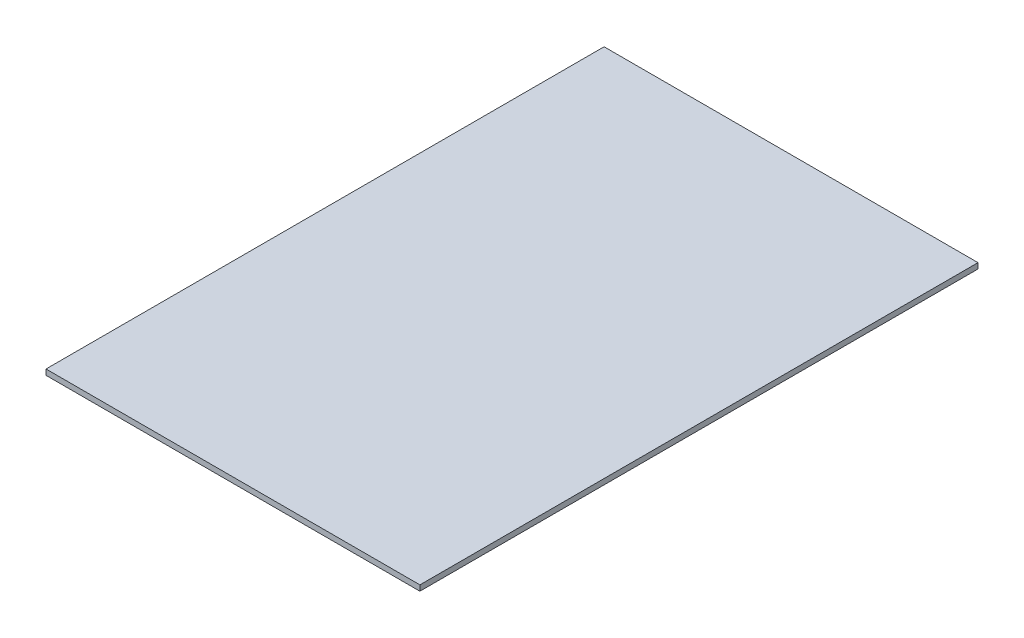
ISO-10303-21;
HEADER;
FILE_DESCRIPTION(('STEP AP214'),'2;1');
FILE_NAME('part.step','',(''),(''),'','','');
FILE_SCHEMA(('AUTOMOTIVE_DESIGN { 1 0 10303 214 1 1 1 1 }'));
ENDSEC;
DATA;
#1=APPLICATION_CONTEXT('core data for automotive mechanical design processes');
#2=APPLICATION_PROTOCOL_DEFINITION('international standard','automotive_design',2000,#1);
#3=PRODUCT_CONTEXT('',#1,'mechanical');
#4=PRODUCT('Part','Part','',(#3));
#5=PRODUCT_RELATED_PRODUCT_CATEGORY('part','',(#4));
#6=PRODUCT_DEFINITION_FORMATION('','',#4);
#7=PRODUCT_DEFINITION_CONTEXT('part definition',#1,'design');
#8=PRODUCT_DEFINITION('design','',#6,#7);
#9=PRODUCT_DEFINITION_SHAPE('','',#8);
#10=(LENGTH_UNIT() NAMED_UNIT(*) SI_UNIT(.MILLI.,.METRE.));
#11=(NAMED_UNIT(*) PLANE_ANGLE_UNIT() SI_UNIT($,.RADIAN.));
#12=(NAMED_UNIT(*) SI_UNIT($,.STERADIAN.) SOLID_ANGLE_UNIT());
#13=UNCERTAINTY_MEASURE_WITH_UNIT(LENGTH_MEASURE(1.E-05),#10,'distance_accuracy_value','');
#14=(GEOMETRIC_REPRESENTATION_CONTEXT(3) GLOBAL_UNCERTAINTY_ASSIGNED_CONTEXT((#13)) GLOBAL_UNIT_ASSIGNED_CONTEXT((#10,
#11,#12)) REPRESENTATION_CONTEXT('',''));
#15=CARTESIAN_POINT('',(0.,0.,0.));
#16=DIRECTION('',(0.,0.,1.));
#17=DIRECTION('',(1.,0.,0.));
#18=AXIS2_PLACEMENT_3D('',#15,#16,#17);
#19=CARTESIAN_POINT('',(101.5,3.,-151.5));
#20=DIRECTION('',(-1.,0.,0.));
#21=DIRECTION('',(0.,0.,1.));
#22=AXIS2_PLACEMENT_3D('',#19,#20,#21);
#23=PLANE('',#22);
#24=DIRECTION('',(0.,0.,-1.));
#25=VECTOR('',#24,1.);
#26=CARTESIAN_POINT('',(101.5,0.,-151.5));
#27=LINE('',#26,#25);
#28=CARTESIAN_POINT('',(101.5,0.,151.5));
#29=VERTEX_POINT('',#28);
#30=CARTESIAN_POINT('',(101.5,0.,-151.5));
#31=VERTEX_POINT('',#30);
#32=EDGE_CURVE('E99',#29,#31,#27,.T.);
#33=ORIENTED_EDGE('',*,*,#32,.T.);
#34=DIRECTION('',(0.,-1.,0.));
#35=VECTOR('',#34,1.);
#36=CARTESIAN_POINT('',(101.5,3.,-151.5));
#37=LINE('',#36,#35);
#38=CARTESIAN_POINT('',(101.5,3.,-151.5));
#39=VERTEX_POINT('',#38);
#40=EDGE_CURVE('E11',#39,#31,#37,.T.);
#41=ORIENTED_EDGE('',*,*,#40,.F.);
#42=DIRECTION('',(0.,0.,-1.));
#43=VECTOR('',#42,1.);
#44=CARTESIAN_POINT('',(101.5,3.,-151.5));
#45=LINE('',#44,#43);
#46=CARTESIAN_POINT('',(101.5,3.,151.5));
#47=VERTEX_POINT('',#46);
#48=EDGE_CURVE('E87',#47,#39,#45,.T.);
#49=ORIENTED_EDGE('',*,*,#48,.F.);
#50=DIRECTION('',(0.,-1.,0.));
#51=VECTOR('',#50,1.);
#52=CARTESIAN_POINT('',(101.5,3.,151.5));
#53=LINE('',#52,#51);
#54=EDGE_CURVE('E95',#47,#29,#53,.T.);
#55=ORIENTED_EDGE('',*,*,#54,.T.);
#56=EDGE_LOOP('',(#33,#41,#49,#55));
#57=FACE_BOUND('',#56,.T.);
#58=ADVANCED_FACE('F36',(#57),#23,.F.);
#59=CARTESIAN_POINT('',(-101.5,3.,-151.5));
#60=DIRECTION('',(0.,0.,1.));
#61=DIRECTION('',(1.,0.,0.));
#62=AXIS2_PLACEMENT_3D('',#59,#60,#61);
#63=PLANE('',#62);
#64=DIRECTION('',(-1.,0.,0.));
#65=VECTOR('',#64,1.);
#66=CARTESIAN_POINT('',(-101.5,0.,-151.5));
#67=LINE('',#66,#65);
#68=CARTESIAN_POINT('',(-101.5,0.,-151.5));
#69=VERTEX_POINT('',#68);
#70=EDGE_CURVE('E91',#31,#69,#67,.T.);
#71=ORIENTED_EDGE('',*,*,#70,.T.);
#72=DIRECTION('',(0.,-1.,0.));
#73=VECTOR('',#72,1.);
#74=CARTESIAN_POINT('',(-101.5,3.,-151.5));
#75=LINE('',#74,#73);
#76=CARTESIAN_POINT('',(-101.5,3.,-151.5));
#77=VERTEX_POINT('',#76);
#78=EDGE_CURVE('E44',#77,#69,#75,.T.);
#79=ORIENTED_EDGE('',*,*,#78,.F.);
#80=DIRECTION('',(-1.,0.,0.));
#81=VECTOR('',#80,1.);
#82=CARTESIAN_POINT('',(-101.5,3.,-151.5));
#83=LINE('',#82,#81);
#84=EDGE_CURVE('E82',#39,#77,#83,.T.);
#85=ORIENTED_EDGE('',*,*,#84,.F.);
#86=ORIENTED_EDGE('',*,*,#40,.T.);
#87=EDGE_LOOP('',(#71,#79,#85,#86));
#88=FACE_BOUND('',#87,.T.);
#89=ADVANCED_FACE('F90',(#88),#63,.F.);
#90=CARTESIAN_POINT('',(-101.5,3.,-151.5));
#91=DIRECTION('',(1.,0.,0.));
#92=DIRECTION('',(0.,0.,-1.));
#93=AXIS2_PLACEMENT_3D('',#90,#91,#92);
#94=PLANE('',#93);
#95=DIRECTION('',(0.,0.,1.));
#96=VECTOR('',#95,1.);
#97=CARTESIAN_POINT('',(-101.5,0.,-151.5));
#98=LINE('',#97,#96);
#99=CARTESIAN_POINT('',(-101.5,0.,151.5));
#100=VERTEX_POINT('',#99);
#101=EDGE_CURVE('E69',#69,#100,#98,.T.);
#102=ORIENTED_EDGE('',*,*,#101,.T.);
#103=DIRECTION('',(0.,-1.,0.));
#104=VECTOR('',#103,1.);
#105=CARTESIAN_POINT('',(-101.5,3.,151.5));
#106=LINE('',#105,#104);
#107=CARTESIAN_POINT('',(-101.5,3.,151.5));
#108=VERTEX_POINT('',#107);
#109=EDGE_CURVE('E92',#108,#100,#106,.T.);
#110=ORIENTED_EDGE('',*,*,#109,.F.);
#111=DIRECTION('',(0.,0.,1.));
#112=VECTOR('',#111,1.);
#113=CARTESIAN_POINT('',(-101.5,3.,-151.5));
#114=LINE('',#113,#112);
#115=EDGE_CURVE('E85',#77,#108,#114,.T.);
#116=ORIENTED_EDGE('',*,*,#115,.F.);
#117=ORIENTED_EDGE('',*,*,#78,.T.);
#118=EDGE_LOOP('',(#102,#110,#116,#117));
#119=FACE_BOUND('',#118,.T.);
#120=ADVANCED_FACE('F93',(#119),#94,.F.);
#121=CARTESIAN_POINT('',(-101.5,3.,151.5));
#122=DIRECTION('',(0.,0.,-1.));
#123=DIRECTION('',(-1.,0.,0.));
#124=AXIS2_PLACEMENT_3D('',#121,#122,#123);
#125=PLANE('',#124);
#126=DIRECTION('',(1.,0.,0.));
#127=VECTOR('',#126,1.);
#128=CARTESIAN_POINT('',(-101.5,0.,151.5));
#129=LINE('',#128,#127);
#130=EDGE_CURVE('E75',#100,#29,#129,.T.);
#131=ORIENTED_EDGE('',*,*,#130,.T.);
#132=ORIENTED_EDGE('',*,*,#54,.F.);
#133=DIRECTION('',(1.,0.,0.));
#134=VECTOR('',#133,1.);
#135=CARTESIAN_POINT('',(-101.5,3.,151.5));
#136=LINE('',#135,#134);
#137=EDGE_CURVE('E52',#108,#47,#136,.T.);
#138=ORIENTED_EDGE('',*,*,#137,.F.);
#139=ORIENTED_EDGE('',*,*,#109,.T.);
#140=EDGE_LOOP('',(#131,#132,#138,#139));
#141=FACE_BOUND('',#140,.T.);
#142=ADVANCED_FACE('F106',(#141),#125,.F.);
#143=CARTESIAN_POINT('',(0.,3.,0.));
#144=DIRECTION('',(0.,1.,0.));
#145=DIRECTION('',(0.,0.,1.));
#146=AXIS2_PLACEMENT_3D('',#143,#144,#145);
#147=PLANE('',#146);
#148=ORIENTED_EDGE('',*,*,#48,.T.);
#149=ORIENTED_EDGE('',*,*,#84,.T.);
#150=ORIENTED_EDGE('',*,*,#115,.T.);
#151=ORIENTED_EDGE('',*,*,#137,.T.);
#152=EDGE_LOOP('',(#148,#149,#150,#151));
#153=FACE_BOUND('',#152,.T.);
#154=ADVANCED_FACE('F83',(#153),#147,.T.);
#155=CARTESIAN_POINT('',(0.,0.,0.));
#156=DIRECTION('',(0.,1.,0.));
#157=DIRECTION('',(0.,0.,1.));
#158=AXIS2_PLACEMENT_3D('',#155,#156,#157);
#159=PLANE('',#158);
#160=ORIENTED_EDGE('',*,*,#32,.F.);
#161=ORIENTED_EDGE('',*,*,#130,.F.);
#162=ORIENTED_EDGE('',*,*,#101,.F.);
#163=ORIENTED_EDGE('',*,*,#70,.F.);
#164=EDGE_LOOP('',(#160,#161,#162,#163));
#165=FACE_BOUND('',#164,.T.);
#166=ADVANCED_FACE('F109',(#165),#159,.F.);
#167=CLOSED_SHELL('',(#58,#89,#120,#142,#154,#166));
#168=MANIFOLD_SOLID_BREP('B2',#167);
#169=ADVANCED_BREP_SHAPE_REPRESENTATION('',(#18,#168),#14);
#170=SHAPE_DEFINITION_REPRESENTATION(#9,#169);
ENDSEC;
END-ISO-10303-21;
